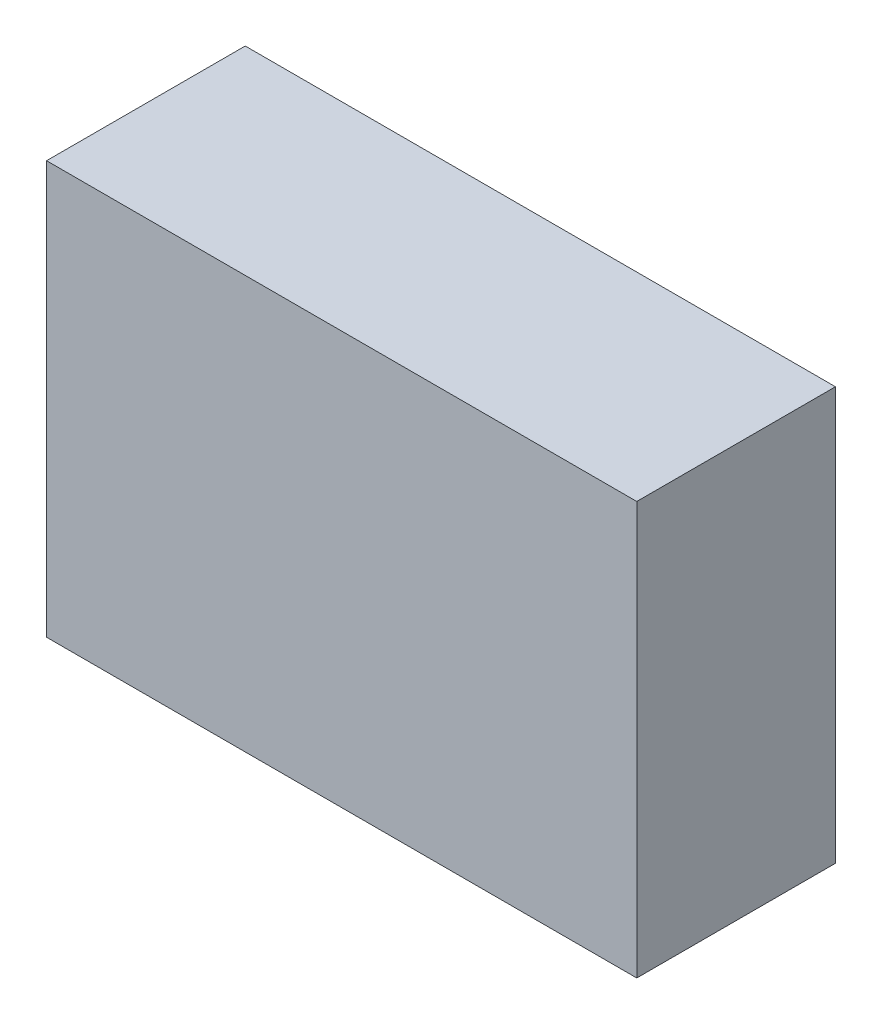
ISO-10303-21;
HEADER;
FILE_DESCRIPTION(('STEP AP214'),'2;1');
FILE_NAME('part.step','',(''),(''),'','','');
FILE_SCHEMA(('AUTOMOTIVE_DESIGN { 1 0 10303 214 1 1 1 1 }'));
ENDSEC;
DATA;
#1=APPLICATION_CONTEXT('core data for automotive mechanical design processes');
#2=APPLICATION_PROTOCOL_DEFINITION('international standard','automotive_design',2000,#1);
#3=PRODUCT_CONTEXT('',#1,'mechanical');
#4=PRODUCT('Part','Part','',(#3));
#5=PRODUCT_RELATED_PRODUCT_CATEGORY('part','',(#4));
#6=PRODUCT_DEFINITION_FORMATION('','',#4);
#7=PRODUCT_DEFINITION_CONTEXT('part definition',#1,'design');
#8=PRODUCT_DEFINITION('design','',#6,#7);
#9=PRODUCT_DEFINITION_SHAPE('','',#8);
#10=(LENGTH_UNIT() NAMED_UNIT(*) SI_UNIT(.MILLI.,.METRE.));
#11=(NAMED_UNIT(*) PLANE_ANGLE_UNIT() SI_UNIT($,.RADIAN.));
#12=(NAMED_UNIT(*) SI_UNIT($,.STERADIAN.) SOLID_ANGLE_UNIT());
#13=UNCERTAINTY_MEASURE_WITH_UNIT(LENGTH_MEASURE(1.E-05),#10,'distance_accuracy_value','');
#14=(GEOMETRIC_REPRESENTATION_CONTEXT(3) GLOBAL_UNCERTAINTY_ASSIGNED_CONTEXT((#13)) GLOBAL_UNIT_ASSIGNED_CONTEXT((#10,
#11,#12)) REPRESENTATION_CONTEXT('',''));
#15=CARTESIAN_POINT('',(0.,0.,0.));
#16=DIRECTION('',(0.,0.,1.));
#17=DIRECTION('',(1.,0.,0.));
#18=AXIS2_PLACEMENT_3D('',#15,#16,#17);
#19=CARTESIAN_POINT('',(0.,0.,2.72));
#20=DIRECTION('',(-1.,0.,0.));
#21=DIRECTION('',(0.,0.,1.));
#22=AXIS2_PLACEMENT_3D('',#19,#20,#21);
#23=PLANE('',#22);
#24=DIRECTION('',(0.,1.,0.));
#25=VECTOR('',#24,1.);
#26=CARTESIAN_POINT('',(0.,0.,0.));
#27=LINE('',#26,#25);
#28=CARTESIAN_POINT('',(0.,0.,0.));
#29=VERTEX_POINT('',#28);
#30=CARTESIAN_POINT('',(0.,5.65,0.));
#31=VERTEX_POINT('',#30);
#32=EDGE_CURVE('E138',#29,#31,#27,.T.);
#33=ORIENTED_EDGE('',*,*,#32,.F.);
#34=DIRECTION('',(0.,0.,-1.));
#35=VECTOR('',#34,1.);
#36=CARTESIAN_POINT('',(0.,0.,2.72));
#37=LINE('',#36,#35);
#38=CARTESIAN_POINT('',(0.,0.,2.72));
#39=VERTEX_POINT('',#38);
#40=EDGE_CURVE('E11',#39,#29,#37,.T.);
#41=ORIENTED_EDGE('',*,*,#40,.F.);
#42=DIRECTION('',(0.,1.,0.));
#43=VECTOR('',#42,1.);
#44=CARTESIAN_POINT('',(0.,0.,2.72));
#45=LINE('',#44,#43);
#46=CARTESIAN_POINT('',(0.,5.65,2.72));
#47=VERTEX_POINT('',#46);
#48=EDGE_CURVE('E142',#39,#47,#45,.T.);
#49=ORIENTED_EDGE('',*,*,#48,.T.);
#50=DIRECTION('',(0.,0.,-1.));
#51=VECTOR('',#50,1.);
#52=CARTESIAN_POINT('',(0.,5.65,2.72));
#53=LINE('',#52,#51);
#54=EDGE_CURVE('E35',#47,#31,#53,.T.);
#55=ORIENTED_EDGE('',*,*,#54,.T.);
#56=EDGE_LOOP('',(#33,#41,#49,#55));
#57=FACE_BOUND('',#56,.T.);
#58=ADVANCED_FACE('F32',(#57),#23,.T.);
#59=CARTESIAN_POINT('',(0.,0.,2.72));
#60=DIRECTION('',(0.,1.,0.));
#61=DIRECTION('',(0.,0.,1.));
#62=AXIS2_PLACEMENT_3D('',#59,#60,#61);
#63=PLANE('',#62);
#64=DIRECTION('',(1.,0.,0.));
#65=VECTOR('',#64,1.);
#66=CARTESIAN_POINT('',(6.425,0.,0.42));
#67=LINE('',#66,#65);
#68=CARTESIAN_POINT('',(1.655,0.,0.419999999999999));
#69=VERTEX_POINT('',#68);
#70=CARTESIAN_POINT('',(6.425,0.,0.42));
#71=VERTEX_POINT('',#70);
#72=EDGE_CURVE('E132',#69,#71,#67,.T.);
#73=ORIENTED_EDGE('',*,*,#72,.F.);
#74=DIRECTION('',(0.510115873750163,0.,-0.860105688475612));
#75=VECTOR('',#74,1.);
#76=CARTESIAN_POINT('',(1.655,0.,0.42));
#77=LINE('',#76,#75);
#78=CARTESIAN_POINT('',(0.54,0.,2.3));
#79=VERTEX_POINT('',#78);
#80=EDGE_CURVE('E48',#79,#69,#77,.T.);
#81=ORIENTED_EDGE('',*,*,#80,.F.);
#82=DIRECTION('',(-1.,0.,0.));
#83=VECTOR('',#82,1.);
#84=CARTESIAN_POINT('',(0.54,0.,2.3));
#85=LINE('',#84,#83);
#86=CARTESIAN_POINT('',(7.54,0.,2.3));
#87=VERTEX_POINT('',#86);
#88=EDGE_CURVE('E123',#87,#79,#85,.T.);
#89=ORIENTED_EDGE('',*,*,#88,.F.);
#90=DIRECTION('',(0.510115873750163,0.,0.860105688475612));
#91=VECTOR('',#90,1.);
#92=CARTESIAN_POINT('',(7.54,0.,2.3));
#93=LINE('',#92,#91);
#94=EDGE_CURVE('E126',#71,#87,#93,.T.);
#95=ORIENTED_EDGE('',*,*,#94,.F.);
#96=EDGE_LOOP('',(#73,#81,#89,#95));
#97=FACE_BOUND('',#96,.T.);
#98=DIRECTION('',(1.,0.,0.));
#99=VECTOR('',#98,1.);
#100=CARTESIAN_POINT('',(0.,0.,0.));
#101=LINE('',#100,#99);
#102=CARTESIAN_POINT('',(8.08,0.,0.));
#103=VERTEX_POINT('',#102);
#104=EDGE_CURVE('E145',#29,#103,#101,.T.);
#105=ORIENTED_EDGE('',*,*,#104,.T.);
#106=DIRECTION('',(0.,0.,-1.));
#107=VECTOR('',#106,1.);
#108=CARTESIAN_POINT('',(8.08,0.,2.72));
#109=LINE('',#108,#107);
#110=CARTESIAN_POINT('',(8.08,0.,2.72));
#111=VERTEX_POINT('',#110);
#112=EDGE_CURVE('E40',#111,#103,#109,.T.);
#113=ORIENTED_EDGE('',*,*,#112,.F.);
#114=DIRECTION('',(1.,0.,0.));
#115=VECTOR('',#114,1.);
#116=CARTESIAN_POINT('',(0.,0.,2.72));
#117=LINE('',#116,#115);
#118=EDGE_CURVE('E149',#39,#111,#117,.T.);
#119=ORIENTED_EDGE('',*,*,#118,.F.);
#120=ORIENTED_EDGE('',*,*,#40,.T.);
#121=EDGE_LOOP('',(#105,#113,#119,#120));
#122=FACE_BOUND('',#121,.T.);
#123=ADVANCED_FACE('F169',(#97,#122),#63,.F.);
#124=CARTESIAN_POINT('',(8.08,0.,2.72));
#125=DIRECTION('',(-1.,0.,0.));
#126=DIRECTION('',(0.,0.,1.));
#127=AXIS2_PLACEMENT_3D('',#124,#125,#126);
#128=PLANE('',#127);
#129=DIRECTION('',(0.,1.,0.));
#130=VECTOR('',#129,1.);
#131=CARTESIAN_POINT('',(8.08,0.,0.));
#132=LINE('',#131,#130);
#133=CARTESIAN_POINT('',(8.08,5.65,0.));
#134=VERTEX_POINT('',#133);
#135=EDGE_CURVE('E156',#103,#134,#132,.T.);
#136=ORIENTED_EDGE('',*,*,#135,.T.);
#137=DIRECTION('',(0.,0.,-1.));
#138=VECTOR('',#137,1.);
#139=CARTESIAN_POINT('',(8.08,5.65,2.72));
#140=LINE('',#139,#138);
#141=CARTESIAN_POINT('',(8.08,5.65,2.72));
#142=VERTEX_POINT('',#141);
#143=EDGE_CURVE('E161',#142,#134,#140,.T.);
#144=ORIENTED_EDGE('',*,*,#143,.F.);
#145=DIRECTION('',(0.,1.,0.));
#146=VECTOR('',#145,1.);
#147=CARTESIAN_POINT('',(8.08,0.,2.72));
#148=LINE('',#147,#146);
#149=EDGE_CURVE('E147',#111,#142,#148,.T.);
#150=ORIENTED_EDGE('',*,*,#149,.F.);
#151=ORIENTED_EDGE('',*,*,#112,.T.);
#152=EDGE_LOOP('',(#136,#144,#150,#151));
#153=FACE_BOUND('',#152,.T.);
#154=ADVANCED_FACE('F172',(#153),#128,.F.);
#155=CARTESIAN_POINT('',(0.,5.65,2.72));
#156=DIRECTION('',(0.,1.,0.));
#157=DIRECTION('',(0.,0.,1.));
#158=AXIS2_PLACEMENT_3D('',#155,#156,#157);
#159=PLANE('',#158);
#160=DIRECTION('',(1.,0.,0.));
#161=VECTOR('',#160,1.);
#162=CARTESIAN_POINT('',(0.,5.65,0.));
#163=LINE('',#162,#161);
#164=EDGE_CURVE('E153',#31,#134,#163,.T.);
#165=ORIENTED_EDGE('',*,*,#164,.F.);
#166=ORIENTED_EDGE('',*,*,#54,.F.);
#167=DIRECTION('',(1.,0.,0.));
#168=VECTOR('',#167,1.);
#169=CARTESIAN_POINT('',(0.,5.65,2.72));
#170=LINE('',#169,#168);
#171=EDGE_CURVE('E144',#47,#142,#170,.T.);
#172=ORIENTED_EDGE('',*,*,#171,.T.);
#173=ORIENTED_EDGE('',*,*,#143,.T.);
#174=EDGE_LOOP('',(#165,#166,#172,#173));
#175=FACE_BOUND('',#174,.T.);
#176=ADVANCED_FACE('F164',(#175),#159,.T.);
#177=CARTESIAN_POINT('',(0.,0.,2.72));
#178=DIRECTION('',(0.,0.,-1.));
#179=DIRECTION('',(-1.,0.,0.));
#180=AXIS2_PLACEMENT_3D('',#177,#178,#179);
#181=PLANE('',#180);
#182=ORIENTED_EDGE('',*,*,#48,.F.);
#183=ORIENTED_EDGE('',*,*,#118,.T.);
#184=ORIENTED_EDGE('',*,*,#149,.T.);
#185=ORIENTED_EDGE('',*,*,#171,.F.);
#186=EDGE_LOOP('',(#182,#183,#184,#185));
#187=FACE_BOUND('',#186,.T.);
#188=ADVANCED_FACE('F174',(#187),#181,.F.);
#189=CARTESIAN_POINT('',(0.,0.,0.));
#190=DIRECTION('',(0.,0.,-1.));
#191=DIRECTION('',(-1.,0.,0.));
#192=AXIS2_PLACEMENT_3D('',#189,#190,#191);
#193=PLANE('',#192);
#194=ORIENTED_EDGE('',*,*,#32,.T.);
#195=ORIENTED_EDGE('',*,*,#164,.T.);
#196=ORIENTED_EDGE('',*,*,#135,.F.);
#197=ORIENTED_EDGE('',*,*,#104,.F.);
#198=EDGE_LOOP('',(#194,#195,#196,#197));
#199=FACE_BOUND('',#198,.T.);
#200=ADVANCED_FACE('F167',(#199),#193,.T.);
#201=CARTESIAN_POINT('',(1.655,4.,0.42));
#202=DIRECTION('',(-0.860105688475612,0.,-0.510115873750163));
#203=DIRECTION('',(-0.510115873750163,0.,0.860105688475612));
#204=AXIS2_PLACEMENT_3D('',#201,#202,#203);
#205=PLANE('',#204);
#206=ORIENTED_EDGE('',*,*,#80,.T.);
#207=DIRECTION('',(0.,-1.,0.));
#208=VECTOR('',#207,1.);
#209=CARTESIAN_POINT('',(1.655,4.,0.42));
#210=LINE('',#209,#208);
#211=CARTESIAN_POINT('',(1.655,4.,0.42));
#212=VERTEX_POINT('',#211);
#213=EDGE_CURVE('E101',#212,#69,#210,.T.);
#214=ORIENTED_EDGE('',*,*,#213,.F.);
#215=DIRECTION('',(0.510115873750163,0.,-0.860105688475612));
#216=VECTOR('',#215,1.);
#217=CARTESIAN_POINT('',(1.655,4.,0.42));
#218=LINE('',#217,#216);
#219=CARTESIAN_POINT('',(0.54,4.,2.3));
#220=VERTEX_POINT('',#219);
#221=EDGE_CURVE('E105',#220,#212,#218,.T.);
#222=ORIENTED_EDGE('',*,*,#221,.F.);
#223=DIRECTION('',(0.,-1.,0.));
#224=VECTOR('',#223,1.);
#225=CARTESIAN_POINT('',(0.54,4.,2.3));
#226=LINE('',#225,#224);
#227=EDGE_CURVE('E136',#220,#79,#226,.T.);
#228=ORIENTED_EDGE('',*,*,#227,.T.);
#229=EDGE_LOOP('',(#206,#214,#222,#228));
#230=FACE_BOUND('',#229,.T.);
#231=ADVANCED_FACE('F103',(#230),#205,.F.);
#232=CARTESIAN_POINT('',(0.54,4.,2.3));
#233=DIRECTION('',(0.,0.,1.));
#234=DIRECTION('',(1.,0.,0.));
#235=AXIS2_PLACEMENT_3D('',#232,#233,#234);
#236=PLANE('',#235);
#237=ORIENTED_EDGE('',*,*,#88,.T.);
#238=ORIENTED_EDGE('',*,*,#227,.F.);
#239=DIRECTION('',(-1.,0.,0.));
#240=VECTOR('',#239,1.);
#241=CARTESIAN_POINT('',(0.54,4.,2.3));
#242=LINE('',#241,#240);
#243=CARTESIAN_POINT('',(7.54,4.,2.3));
#244=VERTEX_POINT('',#243);
#245=EDGE_CURVE('E111',#244,#220,#242,.T.);
#246=ORIENTED_EDGE('',*,*,#245,.F.);
#247=DIRECTION('',(0.,-1.,0.));
#248=VECTOR('',#247,1.);
#249=CARTESIAN_POINT('',(7.54,4.,2.3));
#250=LINE('',#249,#248);
#251=EDGE_CURVE('E139',#244,#87,#250,.T.);
#252=ORIENTED_EDGE('',*,*,#251,.T.);
#253=EDGE_LOOP('',(#237,#238,#246,#252));
#254=FACE_BOUND('',#253,.T.);
#255=ADVANCED_FACE('F198',(#254),#236,.F.);
#256=CARTESIAN_POINT('',(7.54,4.,2.3));
#257=DIRECTION('',(0.860105688475612,0.,-0.510115873750163));
#258=DIRECTION('',(-0.510115873750163,0.,-0.860105688475613));
#259=AXIS2_PLACEMENT_3D('',#256,#257,#258);
#260=PLANE('',#259);
#261=ORIENTED_EDGE('',*,*,#94,.T.);
#262=ORIENTED_EDGE('',*,*,#251,.F.);
#263=DIRECTION('',(0.510115873750163,0.,0.860105688475612));
#264=VECTOR('',#263,1.);
#265=CARTESIAN_POINT('',(7.54,4.,2.3));
#266=LINE('',#265,#264);
#267=CARTESIAN_POINT('',(6.425,4.,0.42));
#268=VERTEX_POINT('',#267);
#269=EDGE_CURVE('E119',#268,#244,#266,.T.);
#270=ORIENTED_EDGE('',*,*,#269,.F.);
#271=DIRECTION('',(0.,-1.,0.));
#272=VECTOR('',#271,1.);
#273=CARTESIAN_POINT('',(6.425,4.,0.42));
#274=LINE('',#273,#272);
#275=EDGE_CURVE('E110',#268,#71,#274,.T.);
#276=ORIENTED_EDGE('',*,*,#275,.T.);
#277=EDGE_LOOP('',(#261,#262,#270,#276));
#278=FACE_BOUND('',#277,.T.);
#279=ADVANCED_FACE('F196',(#278),#260,.F.);
#280=CARTESIAN_POINT('',(6.425,4.,0.42));
#281=DIRECTION('',(0.,0.,-1.));
#282=DIRECTION('',(-1.,0.,0.));
#283=AXIS2_PLACEMENT_3D('',#280,#281,#282);
#284=PLANE('',#283);
#285=ORIENTED_EDGE('',*,*,#72,.T.);
#286=ORIENTED_EDGE('',*,*,#275,.F.);
#287=DIRECTION('',(1.,0.,0.));
#288=VECTOR('',#287,1.);
#289=CARTESIAN_POINT('',(6.425,4.,0.42));
#290=LINE('',#289,#288);
#291=EDGE_CURVE('E114',#212,#268,#290,.T.);
#292=ORIENTED_EDGE('',*,*,#291,.F.);
#293=ORIENTED_EDGE('',*,*,#213,.T.);
#294=EDGE_LOOP('',(#285,#286,#292,#293));
#295=FACE_BOUND('',#294,.T.);
#296=ADVANCED_FACE('F115',(#295),#284,.F.);
#297=CARTESIAN_POINT('',(0.,4.,0.));
#298=DIRECTION('',(0.,-1.,0.));
#299=DIRECTION('',(0.,0.,-1.));
#300=AXIS2_PLACEMENT_3D('',#297,#298,#299);
#301=PLANE('',#300);
#302=ORIENTED_EDGE('',*,*,#221,.T.);
#303=ORIENTED_EDGE('',*,*,#291,.T.);
#304=ORIENTED_EDGE('',*,*,#269,.T.);
#305=ORIENTED_EDGE('',*,*,#245,.T.);
#306=EDGE_LOOP('',(#302,#303,#304,#305));
#307=FACE_BOUND('',#306,.T.);
#308=ADVANCED_FACE('F121',(#307),#301,.T.);
#309=CLOSED_SHELL('',(#58,#123,#154,#176,#188,#200,#231,#255,#279,#296,#308));
#310=MANIFOLD_SOLID_BREP('B2',#309);
#311=ADVANCED_BREP_SHAPE_REPRESENTATION('',(#18,#310),#14);
#312=SHAPE_DEFINITION_REPRESENTATION(#9,#311);
ENDSEC;
END-ISO-10303-21;
